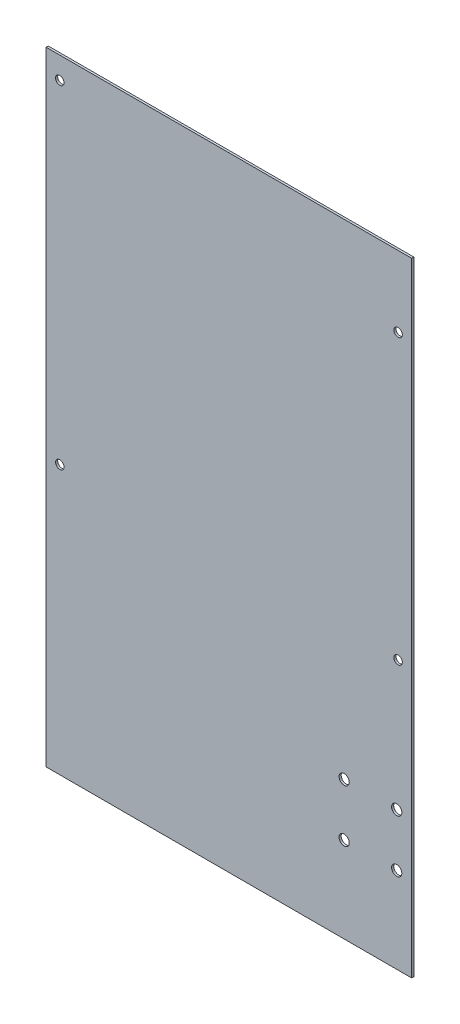
ISO-10303-21;
HEADER;
FILE_DESCRIPTION(('STEP AP214'),'2;1');
FILE_NAME('part.step','',(''),(''),'','','');
FILE_SCHEMA(('AUTOMOTIVE_DESIGN { 1 0 10303 214 1 1 1 1 }'));
ENDSEC;
DATA;
#1=APPLICATION_CONTEXT('core data for automotive mechanical design processes');
#2=APPLICATION_PROTOCOL_DEFINITION('international standard','automotive_design',2000,#1);
#3=PRODUCT_CONTEXT('',#1,'mechanical');
#4=PRODUCT('Part','Part','',(#3));
#5=PRODUCT_RELATED_PRODUCT_CATEGORY('part','',(#4));
#6=PRODUCT_DEFINITION_FORMATION('','',#4);
#7=PRODUCT_DEFINITION_CONTEXT('part definition',#1,'design');
#8=PRODUCT_DEFINITION('design','',#6,#7);
#9=PRODUCT_DEFINITION_SHAPE('','',#8);
#10=(LENGTH_UNIT() NAMED_UNIT(*) SI_UNIT(.MILLI.,.METRE.));
#11=(NAMED_UNIT(*) PLANE_ANGLE_UNIT() SI_UNIT($,.RADIAN.));
#12=(NAMED_UNIT(*) SI_UNIT($,.STERADIAN.) SOLID_ANGLE_UNIT());
#13=UNCERTAINTY_MEASURE_WITH_UNIT(LENGTH_MEASURE(1.E-05),#10,'distance_accuracy_value','');
#14=(GEOMETRIC_REPRESENTATION_CONTEXT(3) GLOBAL_UNCERTAINTY_ASSIGNED_CONTEXT((#13)) GLOBAL_UNIT_ASSIGNED_CONTEXT((#10,
#11,#12)) REPRESENTATION_CONTEXT('',''));
#15=CARTESIAN_POINT('',(0.,0.,0.));
#16=DIRECTION('',(0.,0.,1.));
#17=DIRECTION('',(1.,0.,0.));
#18=AXIS2_PLACEMENT_3D('',#15,#16,#17);
#19=CARTESIAN_POINT('',(-85.09,-145.09,1.));
#20=DIRECTION('',(1.,0.,0.));
#21=DIRECTION('',(0.,0.,-1.));
#22=AXIS2_PLACEMENT_3D('',#19,#20,#21);
#23=PLANE('',#22);
#24=DIRECTION('',(0.,-1.,0.));
#25=VECTOR('',#24,1.);
#26=CARTESIAN_POINT('',(-85.09,-145.09,0.));
#27=LINE('',#26,#25);
#28=CARTESIAN_POINT('',(-85.09,145.09,0.));
#29=VERTEX_POINT('',#28);
#30=CARTESIAN_POINT('',(-85.09,-145.09,0.));
#31=VERTEX_POINT('',#30);
#32=EDGE_CURVE('E107',#29,#31,#27,.T.);
#33=ORIENTED_EDGE('',*,*,#32,.T.);
#34=DIRECTION('',(0.,0.,-1.));
#35=VECTOR('',#34,1.);
#36=CARTESIAN_POINT('',(-85.09,-145.09,1.));
#37=LINE('',#36,#35);
#38=CARTESIAN_POINT('',(-85.09,-145.09,1.));
#39=VERTEX_POINT('',#38);
#40=EDGE_CURVE('E11',#39,#31,#37,.T.);
#41=ORIENTED_EDGE('',*,*,#40,.F.);
#42=DIRECTION('',(0.,-1.,0.));
#43=VECTOR('',#42,1.);
#44=CARTESIAN_POINT('',(-85.09,-145.09,1.));
#45=LINE('',#44,#43);
#46=CARTESIAN_POINT('',(-85.09,145.09,1.));
#47=VERTEX_POINT('',#46);
#48=EDGE_CURVE('E91',#47,#39,#45,.T.);
#49=ORIENTED_EDGE('',*,*,#48,.F.);
#50=DIRECTION('',(0.,0.,-1.));
#51=VECTOR('',#50,1.);
#52=CARTESIAN_POINT('',(-85.09,145.09,1.));
#53=LINE('',#52,#51);
#54=EDGE_CURVE('E103',#47,#29,#53,.T.);
#55=ORIENTED_EDGE('',*,*,#54,.T.);
#56=EDGE_LOOP('',(#33,#41,#49,#55));
#57=FACE_BOUND('',#56,.T.);
#58=ADVANCED_FACE('F39',(#57),#23,.F.);
#59=CARTESIAN_POINT('',(85.09,-145.09,1.));
#60=DIRECTION('',(0.,1.,0.));
#61=DIRECTION('',(-1.,0.,0.));
#62=AXIS2_PLACEMENT_3D('',#59,#60,#61);
#63=PLANE('',#62);
#64=DIRECTION('',(1.,0.,0.));
#65=VECTOR('',#64,1.);
#66=CARTESIAN_POINT('',(85.09,-145.09,0.));
#67=LINE('',#66,#65);
#68=CARTESIAN_POINT('',(85.09,-145.09,0.));
#69=VERTEX_POINT('',#68);
#70=EDGE_CURVE('E96',#31,#69,#67,.T.);
#71=ORIENTED_EDGE('',*,*,#70,.T.);
#72=DIRECTION('',(0.,0.,-1.));
#73=VECTOR('',#72,1.);
#74=CARTESIAN_POINT('',(85.09,-145.09,1.));
#75=LINE('',#74,#73);
#76=CARTESIAN_POINT('',(85.09,-145.09,1.));
#77=VERTEX_POINT('',#76);
#78=EDGE_CURVE('E48',#77,#69,#75,.T.);
#79=ORIENTED_EDGE('',*,*,#78,.F.);
#80=DIRECTION('',(1.,0.,0.));
#81=VECTOR('',#80,1.);
#82=CARTESIAN_POINT('',(85.09,-145.09,1.));
#83=LINE('',#82,#81);
#84=EDGE_CURVE('E86',#39,#77,#83,.T.);
#85=ORIENTED_EDGE('',*,*,#84,.F.);
#86=ORIENTED_EDGE('',*,*,#40,.T.);
#87=EDGE_LOOP('',(#71,#79,#85,#86));
#88=FACE_BOUND('',#87,.T.);
#89=ADVANCED_FACE('F95',(#88),#63,.F.);
#90=CARTESIAN_POINT('',(85.09,-145.09,1.));
#91=DIRECTION('',(-1.,0.,0.));
#92=DIRECTION('',(0.,0.,1.));
#93=AXIS2_PLACEMENT_3D('',#90,#91,#92);
#94=PLANE('',#93);
#95=DIRECTION('',(0.,1.,0.));
#96=VECTOR('',#95,1.);
#97=CARTESIAN_POINT('',(85.09,-145.09,0.));
#98=LINE('',#97,#96);
#99=CARTESIAN_POINT('',(85.09,145.09,0.));
#100=VERTEX_POINT('',#99);
#101=EDGE_CURVE('E73',#69,#100,#98,.T.);
#102=ORIENTED_EDGE('',*,*,#101,.T.);
#103=DIRECTION('',(0.,0.,-1.));
#104=VECTOR('',#103,1.);
#105=CARTESIAN_POINT('',(85.09,145.09,1.));
#106=LINE('',#105,#104);
#107=CARTESIAN_POINT('',(85.09,145.09,1.));
#108=VERTEX_POINT('',#107);
#109=EDGE_CURVE('E98',#108,#100,#106,.T.);
#110=ORIENTED_EDGE('',*,*,#109,.F.);
#111=DIRECTION('',(0.,1.,0.));
#112=VECTOR('',#111,1.);
#113=CARTESIAN_POINT('',(85.09,-145.09,1.));
#114=LINE('',#113,#112);
#115=EDGE_CURVE('E89',#77,#108,#114,.T.);
#116=ORIENTED_EDGE('',*,*,#115,.F.);
#117=ORIENTED_EDGE('',*,*,#78,.T.);
#118=EDGE_LOOP('',(#102,#110,#116,#117));
#119=FACE_BOUND('',#118,.T.);
#120=ADVANCED_FACE('F99',(#119),#94,.F.);
#121=CARTESIAN_POINT('',(85.09,145.09,1.));
#122=DIRECTION('',(0.,-1.,0.));
#123=DIRECTION('',(1.,0.,0.));
#124=AXIS2_PLACEMENT_3D('',#121,#122,#123);
#125=PLANE('',#124);
#126=DIRECTION('',(-1.,0.,0.));
#127=VECTOR('',#126,1.);
#128=CARTESIAN_POINT('',(85.09,145.09,0.));
#129=LINE('',#128,#127);
#130=EDGE_CURVE('E79',#100,#29,#129,.T.);
#131=ORIENTED_EDGE('',*,*,#130,.T.);
#132=ORIENTED_EDGE('',*,*,#54,.F.);
#133=DIRECTION('',(-1.,0.,0.));
#134=VECTOR('',#133,1.);
#135=CARTESIAN_POINT('',(85.09,145.09,1.));
#136=LINE('',#135,#134);
#137=EDGE_CURVE('E56',#108,#47,#136,.T.);
#138=ORIENTED_EDGE('',*,*,#137,.F.);
#139=ORIENTED_EDGE('',*,*,#109,.T.);
#140=EDGE_LOOP('',(#131,#132,#138,#139));
#141=FACE_BOUND('',#140,.T.);
#142=ADVANCED_FACE('F121',(#141),#125,.F.);
#143=CARTESIAN_POINT('',(0.,0.,1.));
#144=DIRECTION('',(0.,0.,1.));
#145=DIRECTION('',(1.,0.,0.));
#146=AXIS2_PLACEMENT_3D('',#143,#144,#145);
#147=PLANE('',#146);
#148=CARTESIAN_POINT('',(78.11,-80.7300000000001,0.999999999999999));
#149=DIRECTION('',(0.,0.,1.));
#150=DIRECTION('',(1.,0.,0.));
#151=AXIS2_PLACEMENT_3D('',#148,#149,#150);
#152=CIRCLE('',#151,2.37999999999999);
#153=CARTESIAN_POINT('',(80.49,-80.7300000000001,0.999999999999999));
#154=VERTEX_POINT('',#153);
#155=EDGE_CURVE('E150',#154,#154,#152,.T.);
#156=ORIENTED_EDGE('',*,*,#155,.F.);
#157=EDGE_LOOP('',(#156));
#158=FACE_BOUND('',#157,.T.);
#159=CARTESIAN_POINT('',(53.64,-80.7300000000001,0.999999999999999));
#160=DIRECTION('',(0.,0.,1.));
#161=DIRECTION('',(1.,0.,0.));
#162=AXIS2_PLACEMENT_3D('',#159,#160,#161);
#163=CIRCLE('',#162,2.38);
#164=CARTESIAN_POINT('',(56.02,-80.7300000000001,0.999999999999999));
#165=VERTEX_POINT('',#164);
#166=EDGE_CURVE('E163',#165,#165,#163,.T.);
#167=ORIENTED_EDGE('',*,*,#166,.F.);
#168=EDGE_LOOP('',(#167));
#169=FACE_BOUND('',#168,.T.);
#170=CARTESIAN_POINT('',(53.64,-105.2,0.999999999999999));
#171=DIRECTION('',(0.,0.,1.));
#172=DIRECTION('',(1.,0.,0.));
#173=AXIS2_PLACEMENT_3D('',#170,#171,#172);
#174=CIRCLE('',#173,2.38);
#175=CARTESIAN_POINT('',(56.02,-105.2,0.999999999999999));
#176=VERTEX_POINT('',#175);
#177=EDGE_CURVE('E167',#176,#176,#174,.T.);
#178=ORIENTED_EDGE('',*,*,#177,.F.);
#179=EDGE_LOOP('',(#178));
#180=FACE_BOUND('',#179,.T.);
#181=CARTESIAN_POINT('',(78.11,-105.2,0.999999999999999));
#182=DIRECTION('',(0.,0.,1.));
#183=DIRECTION('',(1.,0.,0.));
#184=AXIS2_PLACEMENT_3D('',#181,#182,#183);
#185=CIRCLE('',#184,2.37999999999999);
#186=CARTESIAN_POINT('',(80.49,-105.2,0.999999999999999));
#187=VERTEX_POINT('',#186);
#188=EDGE_CURVE('E171',#187,#187,#185,.T.);
#189=ORIENTED_EDGE('',*,*,#188,.F.);
#190=EDGE_LOOP('',(#189));
#191=FACE_BOUND('',#190,.T.);
#192=CARTESIAN_POINT('',(-78.74,134.91,1.));
#193=DIRECTION('',(0.,0.,-1.));
#194=DIRECTION('',(-1.,0.,0.));
#195=AXIS2_PLACEMENT_3D('',#192,#193,#194);
#196=CIRCLE('',#195,1.97500000000001);
#197=CARTESIAN_POINT('',(-80.715,134.91,1.));
#198=VERTEX_POINT('',#197);
#199=EDGE_CURVE('E111',#198,#198,#196,.T.);
#200=ORIENTED_EDGE('',*,*,#199,.T.);
#201=EDGE_LOOP('',(#200));
#202=FACE_BOUND('',#201,.T.);
#203=CARTESIAN_POINT('',(78.74,-20.0100000000001,1.));
#204=DIRECTION('',(0.,0.,-1.));
#205=DIRECTION('',(1.,0.,0.));
#206=AXIS2_PLACEMENT_3D('',#203,#204,#205);
#207=CIRCLE('',#206,1.975);
#208=CARTESIAN_POINT('',(80.715,-20.0100000000001,1.));
#209=VERTEX_POINT('',#208);
#210=EDGE_CURVE('E133',#209,#209,#207,.T.);
#211=ORIENTED_EDGE('',*,*,#210,.T.);
#212=EDGE_LOOP('',(#211));
#213=FACE_BOUND('',#212,.T.);
#214=CARTESIAN_POINT('',(-78.74,-20.0100000000001,1.));
#215=DIRECTION('',(0.,0.,-1.));
#216=DIRECTION('',(-1.,0.,0.));
#217=AXIS2_PLACEMENT_3D('',#214,#215,#216);
#218=CIRCLE('',#217,1.975);
#219=CARTESIAN_POINT('',(-80.715,-20.0100000000001,1.));
#220=VERTEX_POINT('',#219);
#221=EDGE_CURVE('E132',#220,#220,#218,.T.);
#222=ORIENTED_EDGE('',*,*,#221,.T.);
#223=EDGE_LOOP('',(#222));
#224=FACE_BOUND('',#223,.T.);
#225=CARTESIAN_POINT('',(78.74,112.07,1.));
#226=DIRECTION('',(0.,0.,-1.));
#227=DIRECTION('',(1.,0.,0.));
#228=AXIS2_PLACEMENT_3D('',#225,#226,#227);
#229=CIRCLE('',#228,1.97500000000001);
#230=CARTESIAN_POINT('',(80.715,112.07,1.));
#231=VERTEX_POINT('',#230);
#232=EDGE_CURVE('E141',#231,#231,#229,.T.);
#233=ORIENTED_EDGE('',*,*,#232,.T.);
#234=EDGE_LOOP('',(#233));
#235=FACE_BOUND('',#234,.T.);
#236=ORIENTED_EDGE('',*,*,#48,.T.);
#237=ORIENTED_EDGE('',*,*,#84,.T.);
#238=ORIENTED_EDGE('',*,*,#115,.T.);
#239=ORIENTED_EDGE('',*,*,#137,.T.);
#240=EDGE_LOOP('',(#236,#237,#238,#239));
#241=FACE_BOUND('',#240,.T.);
#242=ADVANCED_FACE('F87',(#158,#169,#180,#191,#202,#213,#224,#235,#241),#147,.T.);
#243=CARTESIAN_POINT('',(0.,0.,0.));
#244=DIRECTION('',(0.,0.,1.));
#245=DIRECTION('',(1.,0.,0.));
#246=AXIS2_PLACEMENT_3D('',#243,#244,#245);
#247=PLANE('',#246);
#248=CARTESIAN_POINT('',(78.11,-80.7300000000001,0.));
#249=DIRECTION('',(0.,0.,-1.));
#250=DIRECTION('',(1.,0.,0.));
#251=AXIS2_PLACEMENT_3D('',#248,#249,#250);
#252=CIRCLE('',#251,2.37999999999999);
#253=CARTESIAN_POINT('',(80.49,-80.7300000000001,0.));
#254=VERTEX_POINT('',#253);
#255=EDGE_CURVE('E180',#254,#254,#252,.T.);
#256=ORIENTED_EDGE('',*,*,#255,.F.);
#257=EDGE_LOOP('',(#256));
#258=FACE_BOUND('',#257,.T.);
#259=CARTESIAN_POINT('',(53.64,-80.7300000000001,0.));
#260=DIRECTION('',(0.,0.,-1.));
#261=DIRECTION('',(1.,0.,0.));
#262=AXIS2_PLACEMENT_3D('',#259,#260,#261);
#263=CIRCLE('',#262,2.38);
#264=CARTESIAN_POINT('',(56.02,-80.7300000000001,0.));
#265=VERTEX_POINT('',#264);
#266=EDGE_CURVE('E184',#265,#265,#263,.T.);
#267=ORIENTED_EDGE('',*,*,#266,.F.);
#268=EDGE_LOOP('',(#267));
#269=FACE_BOUND('',#268,.T.);
#270=CARTESIAN_POINT('',(53.64,-105.2,0.));
#271=DIRECTION('',(0.,0.,-1.));
#272=DIRECTION('',(1.,0.,0.));
#273=AXIS2_PLACEMENT_3D('',#270,#271,#272);
#274=CIRCLE('',#273,2.38);
#275=CARTESIAN_POINT('',(56.02,-105.2,0.));
#276=VERTEX_POINT('',#275);
#277=EDGE_CURVE('E179',#276,#276,#274,.T.);
#278=ORIENTED_EDGE('',*,*,#277,.F.);
#279=EDGE_LOOP('',(#278));
#280=FACE_BOUND('',#279,.T.);
#281=CARTESIAN_POINT('',(78.11,-105.2,0.));
#282=DIRECTION('',(0.,0.,-1.));
#283=DIRECTION('',(1.,0.,0.));
#284=AXIS2_PLACEMENT_3D('',#281,#282,#283);
#285=CIRCLE('',#284,2.37999999999999);
#286=CARTESIAN_POINT('',(80.49,-105.2,0.));
#287=VERTEX_POINT('',#286);
#288=EDGE_CURVE('E175',#287,#287,#285,.T.);
#289=ORIENTED_EDGE('',*,*,#288,.F.);
#290=EDGE_LOOP('',(#289));
#291=FACE_BOUND('',#290,.T.);
#292=CARTESIAN_POINT('',(-78.74,134.91,0.));
#293=DIRECTION('',(0.,0.,-1.));
#294=DIRECTION('',(-1.,0.,0.));
#295=AXIS2_PLACEMENT_3D('',#292,#293,#294);
#296=CIRCLE('',#295,1.97500000000001);
#297=CARTESIAN_POINT('',(-80.715,134.91,0.));
#298=VERTEX_POINT('',#297);
#299=EDGE_CURVE('E145',#298,#298,#296,.T.);
#300=ORIENTED_EDGE('',*,*,#299,.F.);
#301=EDGE_LOOP('',(#300));
#302=FACE_BOUND('',#301,.T.);
#303=CARTESIAN_POINT('',(78.74,-20.0100000000001,0.));
#304=DIRECTION('',(0.,0.,-1.));
#305=DIRECTION('',(1.,0.,0.));
#306=AXIS2_PLACEMENT_3D('',#303,#304,#305);
#307=CIRCLE('',#306,1.975);
#308=CARTESIAN_POINT('',(80.715,-20.0100000000001,0.));
#309=VERTEX_POINT('',#308);
#310=EDGE_CURVE('E146',#309,#309,#307,.T.);
#311=ORIENTED_EDGE('',*,*,#310,.F.);
#312=EDGE_LOOP('',(#311));
#313=FACE_BOUND('',#312,.T.);
#314=CARTESIAN_POINT('',(-78.74,-20.0100000000001,0.));
#315=DIRECTION('',(0.,0.,-1.));
#316=DIRECTION('',(-1.,0.,0.));
#317=AXIS2_PLACEMENT_3D('',#314,#315,#316);
#318=CIRCLE('',#317,1.975);
#319=CARTESIAN_POINT('',(-80.715,-20.0100000000001,0.));
#320=VERTEX_POINT('',#319);
#321=EDGE_CURVE('E128',#320,#320,#318,.T.);
#322=ORIENTED_EDGE('',*,*,#321,.F.);
#323=EDGE_LOOP('',(#322));
#324=FACE_BOUND('',#323,.T.);
#325=CARTESIAN_POINT('',(78.74,112.07,0.));
#326=DIRECTION('',(0.,0.,-1.));
#327=DIRECTION('',(1.,0.,0.));
#328=AXIS2_PLACEMENT_3D('',#325,#326,#327);
#329=CIRCLE('',#328,1.97500000000001);
#330=CARTESIAN_POINT('',(80.715,112.07,0.));
#331=VERTEX_POINT('',#330);
#332=EDGE_CURVE('E137',#331,#331,#329,.T.);
#333=ORIENTED_EDGE('',*,*,#332,.F.);
#334=EDGE_LOOP('',(#333));
#335=FACE_BOUND('',#334,.T.);
#336=ORIENTED_EDGE('',*,*,#32,.F.);
#337=ORIENTED_EDGE('',*,*,#130,.F.);
#338=ORIENTED_EDGE('',*,*,#101,.F.);
#339=ORIENTED_EDGE('',*,*,#70,.F.);
#340=EDGE_LOOP('',(#336,#337,#338,#339));
#341=FACE_BOUND('',#340,.T.);
#342=ADVANCED_FACE('F124',(#258,#269,#280,#291,#302,#313,#324,#335,#341),#247,.F.);
#343=CARTESIAN_POINT('',(78.74,112.07,1.));
#344=DIRECTION('',(0.,0.,-1.));
#345=DIRECTION('',(-1.,0.,0.));
#346=AXIS2_PLACEMENT_3D('',#343,#344,#345);
#347=CYLINDRICAL_SURFACE('',#346,1.97500000000001);
#348=ORIENTED_EDGE('',*,*,#232,.F.);
#349=EDGE_LOOP('',(#348));
#350=FACE_BOUND('',#349,.T.);
#351=ORIENTED_EDGE('',*,*,#332,.T.);
#352=EDGE_LOOP('',(#351));
#353=FACE_BOUND('',#352,.T.);
#354=ADVANCED_FACE('F196',(#350,#353),#347,.F.);
#355=CARTESIAN_POINT('',(-78.74,-20.0100000000001,1.));
#356=DIRECTION('',(0.,0.,-1.));
#357=DIRECTION('',(-1.,0.,0.));
#358=AXIS2_PLACEMENT_3D('',#355,#356,#357);
#359=CYLINDRICAL_SURFACE('',#358,1.975);
#360=ORIENTED_EDGE('',*,*,#221,.F.);
#361=EDGE_LOOP('',(#360));
#362=FACE_BOUND('',#361,.T.);
#363=ORIENTED_EDGE('',*,*,#321,.T.);
#364=EDGE_LOOP('',(#363));
#365=FACE_BOUND('',#364,.T.);
#366=ADVANCED_FACE('F210',(#362,#365),#359,.F.);
#367=CARTESIAN_POINT('',(78.74,-20.0100000000001,1.));
#368=DIRECTION('',(0.,0.,-1.));
#369=DIRECTION('',(-1.,0.,0.));
#370=AXIS2_PLACEMENT_3D('',#367,#368,#369);
#371=CYLINDRICAL_SURFACE('',#370,1.975);
#372=ORIENTED_EDGE('',*,*,#210,.F.);
#373=EDGE_LOOP('',(#372));
#374=FACE_BOUND('',#373,.T.);
#375=ORIENTED_EDGE('',*,*,#310,.T.);
#376=EDGE_LOOP('',(#375));
#377=FACE_BOUND('',#376,.T.);
#378=ADVANCED_FACE('F216',(#374,#377),#371,.F.);
#379=CARTESIAN_POINT('',(-78.74,134.91,1.));
#380=DIRECTION('',(0.,0.,-1.));
#381=DIRECTION('',(-1.,0.,0.));
#382=AXIS2_PLACEMENT_3D('',#379,#380,#381);
#383=CYLINDRICAL_SURFACE('',#382,1.97500000000001);
#384=ORIENTED_EDGE('',*,*,#199,.F.);
#385=EDGE_LOOP('',(#384));
#386=FACE_BOUND('',#385,.T.);
#387=ORIENTED_EDGE('',*,*,#299,.T.);
#388=EDGE_LOOP('',(#387));
#389=FACE_BOUND('',#388,.T.);
#390=ADVANCED_FACE('F254',(#386,#389),#383,.F.);
#391=CARTESIAN_POINT('',(78.11,-105.2,10.));
#392=DIRECTION('',(0.,0.,-1.));
#393=DIRECTION('',(-1.,0.,0.));
#394=AXIS2_PLACEMENT_3D('',#391,#392,#393);
#395=CYLINDRICAL_SURFACE('',#394,2.37999999999999);
#396=ORIENTED_EDGE('',*,*,#188,.T.);
#397=EDGE_LOOP('',(#396));
#398=FACE_BOUND('',#397,.T.);
#399=ORIENTED_EDGE('',*,*,#288,.T.);
#400=EDGE_LOOP('',(#399));
#401=FACE_BOUND('',#400,.T.);
#402=ADVANCED_FACE('F258',(#398,#401),#395,.F.);
#403=CARTESIAN_POINT('',(53.64,-105.2,10.));
#404=DIRECTION('',(0.,0.,-1.));
#405=DIRECTION('',(-1.,0.,0.));
#406=AXIS2_PLACEMENT_3D('',#403,#404,#405);
#407=CYLINDRICAL_SURFACE('',#406,2.38);
#408=ORIENTED_EDGE('',*,*,#177,.T.);
#409=EDGE_LOOP('',(#408));
#410=FACE_BOUND('',#409,.T.);
#411=ORIENTED_EDGE('',*,*,#277,.T.);
#412=EDGE_LOOP('',(#411));
#413=FACE_BOUND('',#412,.T.);
#414=ADVANCED_FACE('F192',(#410,#413),#407,.F.);
#415=CARTESIAN_POINT('',(53.64,-80.7300000000001,10.));
#416=DIRECTION('',(0.,0.,-1.));
#417=DIRECTION('',(-1.,0.,0.));
#418=AXIS2_PLACEMENT_3D('',#415,#416,#417);
#419=CYLINDRICAL_SURFACE('',#418,2.38);
#420=ORIENTED_EDGE('',*,*,#166,.T.);
#421=EDGE_LOOP('',(#420));
#422=FACE_BOUND('',#421,.T.);
#423=ORIENTED_EDGE('',*,*,#266,.T.);
#424=EDGE_LOOP('',(#423));
#425=FACE_BOUND('',#424,.T.);
#426=ADVANCED_FACE('F268',(#422,#425),#419,.F.);
#427=CARTESIAN_POINT('',(78.11,-80.7300000000001,10.));
#428=DIRECTION('',(0.,0.,-1.));
#429=DIRECTION('',(-1.,0.,0.));
#430=AXIS2_PLACEMENT_3D('',#427,#428,#429);
#431=CYLINDRICAL_SURFACE('',#430,2.37999999999999);
#432=ORIENTED_EDGE('',*,*,#155,.T.);
#433=EDGE_LOOP('',(#432));
#434=FACE_BOUND('',#433,.T.);
#435=ORIENTED_EDGE('',*,*,#255,.T.);
#436=EDGE_LOOP('',(#435));
#437=FACE_BOUND('',#436,.T.);
#438=ADVANCED_FACE('F265',(#434,#437),#431,.F.);
#439=CLOSED_SHELL('',(#58,#89,#120,#142,#242,#342,#354,#366,#378,#390,#402,#414,#426,#438));
#440=MANIFOLD_SOLID_BREP('B2',#439);
#441=ADVANCED_BREP_SHAPE_REPRESENTATION('',(#18,#440),#14);
#442=SHAPE_DEFINITION_REPRESENTATION(#9,#441);
ENDSEC;
END-ISO-10303-21;
